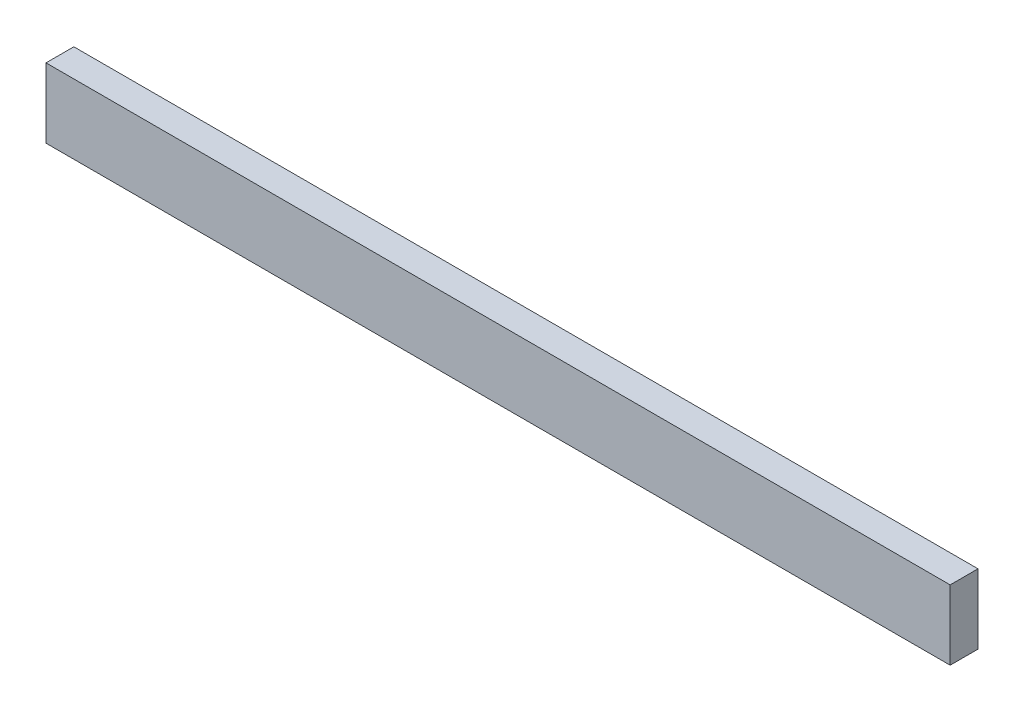
ISO-10303-21;
HEADER;
FILE_DESCRIPTION(('STEP AP214'),'2;1');
FILE_NAME('part.step','',(''),(''),'','','');
FILE_SCHEMA(('AUTOMOTIVE_DESIGN { 1 0 10303 214 1 1 1 1 }'));
ENDSEC;
DATA;
#1=APPLICATION_CONTEXT('core data for automotive mechanical design processes');
#2=APPLICATION_PROTOCOL_DEFINITION('international standard','automotive_design',2000,#1);
#3=PRODUCT_CONTEXT('',#1,'mechanical');
#4=PRODUCT('Part','Part','',(#3));
#5=PRODUCT_RELATED_PRODUCT_CATEGORY('part','',(#4));
#6=PRODUCT_DEFINITION_FORMATION('','',#4);
#7=PRODUCT_DEFINITION_CONTEXT('part definition',#1,'design');
#8=PRODUCT_DEFINITION('design','',#6,#7);
#9=PRODUCT_DEFINITION_SHAPE('','',#8);
#10=(LENGTH_UNIT() NAMED_UNIT(*) SI_UNIT(.MILLI.,.METRE.));
#11=(NAMED_UNIT(*) PLANE_ANGLE_UNIT() SI_UNIT($,.RADIAN.));
#12=(NAMED_UNIT(*) SI_UNIT($,.STERADIAN.) SOLID_ANGLE_UNIT());
#13=UNCERTAINTY_MEASURE_WITH_UNIT(LENGTH_MEASURE(1.E-05),#10,'distance_accuracy_value','');
#14=(GEOMETRIC_REPRESENTATION_CONTEXT(3) GLOBAL_UNCERTAINTY_ASSIGNED_CONTEXT((#13)) GLOBAL_UNIT_ASSIGNED_CONTEXT((#10,
#11,#12)) REPRESENTATION_CONTEXT('',''));
#15=CARTESIAN_POINT('',(0.,0.,0.));
#16=DIRECTION('',(0.,0.,1.));
#17=DIRECTION('',(1.,0.,0.));
#18=AXIS2_PLACEMENT_3D('',#15,#16,#17);
#19=CARTESIAN_POINT('',(-162.4,0.,10.));
#20=DIRECTION('',(1.,0.,0.));
#21=DIRECTION('',(0.,0.,-1.));
#22=AXIS2_PLACEMENT_3D('',#19,#20,#21);
#23=PLANE('',#22);
#24=DIRECTION('',(0.,-1.,0.));
#25=VECTOR('',#24,1.);
#26=CARTESIAN_POINT('',(-162.4,0.,0.));
#27=LINE('',#26,#25);
#28=CARTESIAN_POINT('',(-162.4,25.,0.));
#29=VERTEX_POINT('',#28);
#30=CARTESIAN_POINT('',(-162.4,0.,0.));
#31=VERTEX_POINT('',#30);
#32=EDGE_CURVE('E102',#29,#31,#27,.T.);
#33=ORIENTED_EDGE('',*,*,#32,.T.);
#34=DIRECTION('',(0.,0.,-1.));
#35=VECTOR('',#34,1.);
#36=CARTESIAN_POINT('',(-162.4,0.,10.));
#37=LINE('',#36,#35);
#38=CARTESIAN_POINT('',(-162.4,0.,10.));
#39=VERTEX_POINT('',#38);
#40=EDGE_CURVE('E11',#39,#31,#37,.T.);
#41=ORIENTED_EDGE('',*,*,#40,.F.);
#42=DIRECTION('',(0.,-1.,0.));
#43=VECTOR('',#42,1.);
#44=CARTESIAN_POINT('',(-162.4,0.,10.));
#45=LINE('',#44,#43);
#46=CARTESIAN_POINT('',(-162.4,25.,10.));
#47=VERTEX_POINT('',#46);
#48=EDGE_CURVE('E90',#47,#39,#45,.T.);
#49=ORIENTED_EDGE('',*,*,#48,.F.);
#50=DIRECTION('',(0.,0.,-1.));
#51=VECTOR('',#50,1.);
#52=CARTESIAN_POINT('',(-162.4,25.,10.));
#53=LINE('',#52,#51);
#54=EDGE_CURVE('E98',#47,#29,#53,.T.);
#55=ORIENTED_EDGE('',*,*,#54,.T.);
#56=EDGE_LOOP('',(#33,#41,#49,#55));
#57=FACE_BOUND('',#56,.T.);
#58=ADVANCED_FACE('F39',(#57),#23,.F.);
#59=CARTESIAN_POINT('',(-162.4,0.,10.));
#60=DIRECTION('',(0.,1.,0.));
#61=DIRECTION('',(0.,0.,1.));
#62=AXIS2_PLACEMENT_3D('',#59,#60,#61);
#63=PLANE('',#62);
#64=DIRECTION('',(1.,0.,0.));
#65=VECTOR('',#64,1.);
#66=CARTESIAN_POINT('',(-162.4,0.,0.));
#67=LINE('',#66,#65);
#68=CARTESIAN_POINT('',(162.4,0.,0.));
#69=VERTEX_POINT('',#68);
#70=EDGE_CURVE('E94',#31,#69,#67,.T.);
#71=ORIENTED_EDGE('',*,*,#70,.T.);
#72=DIRECTION('',(0.,0.,-1.));
#73=VECTOR('',#72,1.);
#74=CARTESIAN_POINT('',(162.4,0.,10.));
#75=LINE('',#74,#73);
#76=CARTESIAN_POINT('',(162.4,0.,10.));
#77=VERTEX_POINT('',#76);
#78=EDGE_CURVE('E47',#77,#69,#75,.T.);
#79=ORIENTED_EDGE('',*,*,#78,.F.);
#80=DIRECTION('',(1.,0.,0.));
#81=VECTOR('',#80,1.);
#82=CARTESIAN_POINT('',(-162.4,0.,10.));
#83=LINE('',#82,#81);
#84=EDGE_CURVE('E85',#39,#77,#83,.T.);
#85=ORIENTED_EDGE('',*,*,#84,.F.);
#86=ORIENTED_EDGE('',*,*,#40,.T.);
#87=EDGE_LOOP('',(#71,#79,#85,#86));
#88=FACE_BOUND('',#87,.T.);
#89=ADVANCED_FACE('F93',(#88),#63,.F.);
#90=CARTESIAN_POINT('',(162.4,0.,10.));
#91=DIRECTION('',(-1.,0.,0.));
#92=DIRECTION('',(0.,0.,1.));
#93=AXIS2_PLACEMENT_3D('',#90,#91,#92);
#94=PLANE('',#93);
#95=DIRECTION('',(0.,1.,0.));
#96=VECTOR('',#95,1.);
#97=CARTESIAN_POINT('',(162.4,0.,0.));
#98=LINE('',#97,#96);
#99=CARTESIAN_POINT('',(162.4,25.,0.));
#100=VERTEX_POINT('',#99);
#101=EDGE_CURVE('E72',#69,#100,#98,.T.);
#102=ORIENTED_EDGE('',*,*,#101,.T.);
#103=DIRECTION('',(0.,0.,-1.));
#104=VECTOR('',#103,1.);
#105=CARTESIAN_POINT('',(162.4,25.,10.));
#106=LINE('',#105,#104);
#107=CARTESIAN_POINT('',(162.4,25.,10.));
#108=VERTEX_POINT('',#107);
#109=EDGE_CURVE('E95',#108,#100,#106,.T.);
#110=ORIENTED_EDGE('',*,*,#109,.F.);
#111=DIRECTION('',(0.,1.,0.));
#112=VECTOR('',#111,1.);
#113=CARTESIAN_POINT('',(162.4,0.,10.));
#114=LINE('',#113,#112);
#115=EDGE_CURVE('E88',#77,#108,#114,.T.);
#116=ORIENTED_EDGE('',*,*,#115,.F.);
#117=ORIENTED_EDGE('',*,*,#78,.T.);
#118=EDGE_LOOP('',(#102,#110,#116,#117));
#119=FACE_BOUND('',#118,.T.);
#120=ADVANCED_FACE('F96',(#119),#94,.F.);
#121=CARTESIAN_POINT('',(-162.4,25.,10.));
#122=DIRECTION('',(0.,-1.,0.));
#123=DIRECTION('',(0.,0.,-1.));
#124=AXIS2_PLACEMENT_3D('',#121,#122,#123);
#125=PLANE('',#124);
#126=DIRECTION('',(-1.,0.,0.));
#127=VECTOR('',#126,1.);
#128=CARTESIAN_POINT('',(-162.4,25.,0.));
#129=LINE('',#128,#127);
#130=EDGE_CURVE('E78',#100,#29,#129,.T.);
#131=ORIENTED_EDGE('',*,*,#130,.T.);
#132=ORIENTED_EDGE('',*,*,#54,.F.);
#133=DIRECTION('',(-1.,0.,0.));
#134=VECTOR('',#133,1.);
#135=CARTESIAN_POINT('',(-162.4,25.,10.));
#136=LINE('',#135,#134);
#137=EDGE_CURVE('E55',#108,#47,#136,.T.);
#138=ORIENTED_EDGE('',*,*,#137,.F.);
#139=ORIENTED_EDGE('',*,*,#109,.T.);
#140=EDGE_LOOP('',(#131,#132,#138,#139));
#141=FACE_BOUND('',#140,.T.);
#142=ADVANCED_FACE('F109',(#141),#125,.F.);
#143=CARTESIAN_POINT('',(0.,0.,10.));
#144=DIRECTION('',(0.,0.,-1.));
#145=DIRECTION('',(-1.,0.,0.));
#146=AXIS2_PLACEMENT_3D('',#143,#144,#145);
#147=PLANE('',#146);
#148=ORIENTED_EDGE('',*,*,#48,.T.);
#149=ORIENTED_EDGE('',*,*,#84,.T.);
#150=ORIENTED_EDGE('',*,*,#115,.T.);
#151=ORIENTED_EDGE('',*,*,#137,.T.);
#152=EDGE_LOOP('',(#148,#149,#150,#151));
#153=FACE_BOUND('',#152,.T.);
#154=ADVANCED_FACE('F86',(#153),#147,.F.);
#155=CARTESIAN_POINT('',(0.,0.,0.));
#156=DIRECTION('',(0.,0.,-1.));
#157=DIRECTION('',(-1.,0.,0.));
#158=AXIS2_PLACEMENT_3D('',#155,#156,#157);
#159=PLANE('',#158);
#160=ORIENTED_EDGE('',*,*,#32,.F.);
#161=ORIENTED_EDGE('',*,*,#130,.F.);
#162=ORIENTED_EDGE('',*,*,#101,.F.);
#163=ORIENTED_EDGE('',*,*,#70,.F.);
#164=EDGE_LOOP('',(#160,#161,#162,#163));
#165=FACE_BOUND('',#164,.T.);
#166=ADVANCED_FACE('F112',(#165),#159,.T.);
#167=CLOSED_SHELL('',(#58,#89,#120,#142,#154,#166));
#168=MANIFOLD_SOLID_BREP('B2',#167);
#169=ADVANCED_BREP_SHAPE_REPRESENTATION('',(#18,#168),#14);
#170=SHAPE_DEFINITION_REPRESENTATION(#9,#169);
ENDSEC;
END-ISO-10303-21;
